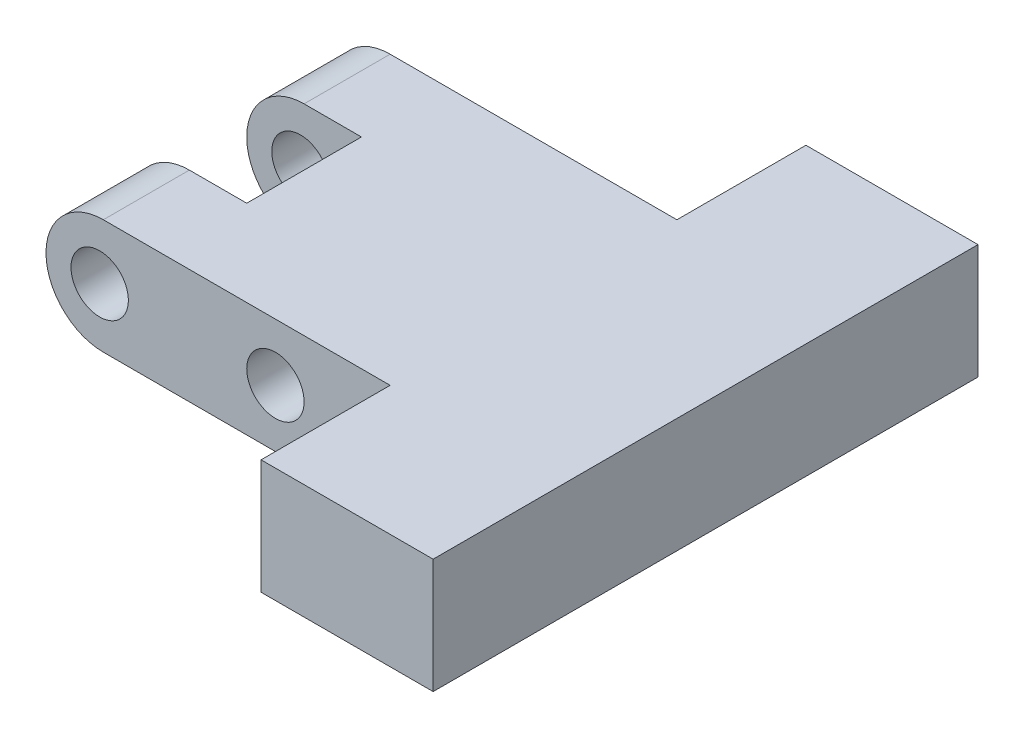
ISO-10303-21;
HEADER;
FILE_DESCRIPTION(('STEP AP214'),'2;1');
FILE_NAME('part.step','',(''),(''),'','','');
FILE_SCHEMA(('AUTOMOTIVE_DESIGN { 1 0 10303 214 1 1 1 1 }'));
ENDSEC;
DATA;
#1=APPLICATION_CONTEXT('core data for automotive mechanical design processes');
#2=APPLICATION_PROTOCOL_DEFINITION('international standard','automotive_design',2000,#1);
#3=PRODUCT_CONTEXT('',#1,'mechanical');
#4=PRODUCT('Part','Part','',(#3));
#5=PRODUCT_RELATED_PRODUCT_CATEGORY('part','',(#4));
#6=PRODUCT_DEFINITION_FORMATION('','',#4);
#7=PRODUCT_DEFINITION_CONTEXT('part definition',#1,'design');
#8=PRODUCT_DEFINITION('design','',#6,#7);
#9=PRODUCT_DEFINITION_SHAPE('','',#8);
#10=(LENGTH_UNIT() NAMED_UNIT(*) SI_UNIT(.MILLI.,.METRE.));
#11=(NAMED_UNIT(*) PLANE_ANGLE_UNIT() SI_UNIT($,.RADIAN.));
#12=(NAMED_UNIT(*) SI_UNIT($,.STERADIAN.) SOLID_ANGLE_UNIT());
#13=UNCERTAINTY_MEASURE_WITH_UNIT(LENGTH_MEASURE(1.E-05),#10,'distance_accuracy_value','');
#14=(GEOMETRIC_REPRESENTATION_CONTEXT(3) GLOBAL_UNCERTAINTY_ASSIGNED_CONTEXT((#13)) GLOBAL_UNIT_ASSIGNED_CONTEXT((#10,
#11,#12)) REPRESENTATION_CONTEXT('',''));
#15=CARTESIAN_POINT('',(0.,0.,0.));
#16=DIRECTION('',(0.,0.,1.));
#17=DIRECTION('',(1.,0.,0.));
#18=AXIS2_PLACEMENT_3D('',#15,#16,#17);
#19=CARTESIAN_POINT('',(0.,4.,0.));
#20=DIRECTION('',(0.,0.,-1.));
#21=DIRECTION('',(-1.,0.,0.));
#22=AXIS2_PLACEMENT_3D('',#19,#20,#21);
#23=PLANE('',#22);
#24=DIRECTION('',(1.,0.,0.));
#25=VECTOR('',#24,1.);
#26=CARTESIAN_POINT('',(0.,0.,0.));
#27=LINE('',#26,#25);
#28=CARTESIAN_POINT('',(0.,0.,0.));
#29=VERTEX_POINT('',#28);
#30=CARTESIAN_POINT('',(6.,0.,0.));
#31=VERTEX_POINT('',#30);
#32=EDGE_CURVE('E198',#29,#31,#27,.T.);
#33=ORIENTED_EDGE('',*,*,#32,.T.);
#34=DIRECTION('',(0.,-1.,0.));
#35=VECTOR('',#34,1.);
#36=CARTESIAN_POINT('',(6.,4.,0.));
#37=LINE('',#36,#35);
#38=CARTESIAN_POINT('',(6.,4.,0.));
#39=VERTEX_POINT('',#38);
#40=EDGE_CURVE('E11',#39,#31,#37,.T.);
#41=ORIENTED_EDGE('',*,*,#40,.F.);
#42=DIRECTION('',(1.,0.,0.));
#43=VECTOR('',#42,1.);
#44=CARTESIAN_POINT('',(0.,4.,0.));
#45=LINE('',#44,#43);
#46=CARTESIAN_POINT('',(0.,4.,0.));
#47=VERTEX_POINT('',#46);
#48=EDGE_CURVE('E202',#47,#39,#45,.T.);
#49=ORIENTED_EDGE('',*,*,#48,.F.);
#50=DIRECTION('',(0.,-1.,0.));
#51=VECTOR('',#50,1.);
#52=CARTESIAN_POINT('',(0.,4.,0.));
#53=LINE('',#52,#51);
#54=EDGE_CURVE('E246',#47,#29,#53,.T.);
#55=ORIENTED_EDGE('',*,*,#54,.T.);
#56=EDGE_LOOP('',(#33,#41,#49,#55));
#57=FACE_BOUND('',#56,.T.);
#58=ADVANCED_FACE('F41',(#57),#23,.F.);
#59=CARTESIAN_POINT('',(6.,4.,0.));
#60=DIRECTION('',(-1.,0.,0.));
#61=DIRECTION('',(0.,0.,1.));
#62=AXIS2_PLACEMENT_3D('',#59,#60,#61);
#63=PLANE('',#62);
#64=DIRECTION('',(0.,0.,-1.));
#65=VECTOR('',#64,1.);
#66=CARTESIAN_POINT('',(6.,0.,0.));
#67=LINE('',#66,#65);
#68=CARTESIAN_POINT('',(6.,0.,-19.));
#69=VERTEX_POINT('',#68);
#70=EDGE_CURVE('E230',#31,#69,#67,.T.);
#71=ORIENTED_EDGE('',*,*,#70,.T.);
#72=DIRECTION('',(0.,-1.,0.));
#73=VECTOR('',#72,1.);
#74=CARTESIAN_POINT('',(6.,4.,-19.));
#75=LINE('',#74,#73);
#76=CARTESIAN_POINT('',(6.,4.,-19.));
#77=VERTEX_POINT('',#76);
#78=EDGE_CURVE('E50',#77,#69,#75,.T.);
#79=ORIENTED_EDGE('',*,*,#78,.F.);
#80=DIRECTION('',(0.,0.,-1.));
#81=VECTOR('',#80,1.);
#82=CARTESIAN_POINT('',(6.,4.,0.));
#83=LINE('',#82,#81);
#84=EDGE_CURVE('E206',#39,#77,#83,.T.);
#85=ORIENTED_EDGE('',*,*,#84,.F.);
#86=ORIENTED_EDGE('',*,*,#40,.T.);
#87=EDGE_LOOP('',(#71,#79,#85,#86));
#88=FACE_BOUND('',#87,.T.);
#89=ADVANCED_FACE('F322',(#88),#63,.F.);
#90=CARTESIAN_POINT('',(0.,4.,-19.));
#91=DIRECTION('',(0.,0.,-1.));
#92=DIRECTION('',(-1.,0.,0.));
#93=AXIS2_PLACEMENT_3D('',#90,#91,#92);
#94=PLANE('',#93);
#95=DIRECTION('',(1.,0.,0.));
#96=VECTOR('',#95,1.);
#97=CARTESIAN_POINT('',(0.,0.,-19.));
#98=LINE('',#97,#96);
#99=CARTESIAN_POINT('',(0.,0.,-19.));
#100=VERTEX_POINT('',#99);
#101=EDGE_CURVE('E234',#100,#69,#98,.T.);
#102=ORIENTED_EDGE('',*,*,#101,.F.);
#103=DIRECTION('',(0.,-1.,0.));
#104=VECTOR('',#103,1.);
#105=CARTESIAN_POINT('',(0.,4.,-19.));
#106=LINE('',#105,#104);
#107=CARTESIAN_POINT('',(0.,4.,-19.));
#108=VERTEX_POINT('',#107);
#109=EDGE_CURVE('E255',#108,#100,#106,.T.);
#110=ORIENTED_EDGE('',*,*,#109,.F.);
#111=DIRECTION('',(1.,0.,0.));
#112=VECTOR('',#111,1.);
#113=CARTESIAN_POINT('',(0.,4.,-19.));
#114=LINE('',#113,#112);
#115=EDGE_CURVE('E210',#108,#77,#114,.T.);
#116=ORIENTED_EDGE('',*,*,#115,.T.);
#117=ORIENTED_EDGE('',*,*,#78,.T.);
#118=EDGE_LOOP('',(#102,#110,#116,#117));
#119=FACE_BOUND('',#118,.T.);
#120=ADVANCED_FACE('F327',(#119),#94,.T.);
#121=CARTESIAN_POINT('',(0.,4.,0.));
#122=DIRECTION('',(-1.,0.,0.));
#123=DIRECTION('',(0.,0.,1.));
#124=AXIS2_PLACEMENT_3D('',#121,#122,#123);
#125=PLANE('',#124);
#126=DIRECTION('',(0.,0.,-1.));
#127=VECTOR('',#126,1.);
#128=CARTESIAN_POINT('',(0.,0.,0.));
#129=LINE('',#128,#127);
#130=CARTESIAN_POINT('',(0.,0.,-14.5));
#131=VERTEX_POINT('',#130);
#132=EDGE_CURVE('E238',#131,#100,#129,.T.);
#133=ORIENTED_EDGE('',*,*,#132,.F.);
#134=DIRECTION('',(0.,-1.,0.));
#135=VECTOR('',#134,1.);
#136=CARTESIAN_POINT('',(0.,4.,-14.5));
#137=LINE('',#136,#135);
#138=CARTESIAN_POINT('',(0.,4.,-14.5));
#139=VERTEX_POINT('',#138);
#140=EDGE_CURVE('E252',#139,#131,#137,.T.);
#141=ORIENTED_EDGE('',*,*,#140,.F.);
#142=DIRECTION('',(0.,0.,-1.));
#143=VECTOR('',#142,1.);
#144=CARTESIAN_POINT('',(0.,4.,0.));
#145=LINE('',#144,#143);
#146=EDGE_CURVE('E214',#139,#108,#145,.T.);
#147=ORIENTED_EDGE('',*,*,#146,.T.);
#148=ORIENTED_EDGE('',*,*,#109,.T.);
#149=EDGE_LOOP('',(#133,#141,#147,#148));
#150=FACE_BOUND('',#149,.T.);
#151=ADVANCED_FACE('F335',(#150),#125,.T.);
#152=CARTESIAN_POINT('',(0.,4.,-14.5));
#153=DIRECTION('',(0.,0.,1.));
#154=DIRECTION('',(1.,0.,0.));
#155=AXIS2_PLACEMENT_3D('',#152,#153,#154);
#156=PLANE('',#155);
#157=CARTESIAN_POINT('',(-4.,2.,-14.5));
#158=DIRECTION('',(0.,0.,-1.));
#159=DIRECTION('',(-1.,0.,0.));
#160=AXIS2_PLACEMENT_3D('',#157,#158,#159);
#161=CIRCLE('',#160,1.);
#162=CARTESIAN_POINT('',(-5.,2.,-14.5));
#163=VERTEX_POINT('',#162);
#164=EDGE_CURVE('E276',#163,#163,#161,.T.);
#165=ORIENTED_EDGE('',*,*,#164,.F.);
#166=EDGE_LOOP('',(#165));
#167=FACE_BOUND('',#166,.T.);
#168=CARTESIAN_POINT('',(-10.1279723834454,2.,-14.5));
#169=DIRECTION('',(0.,0.,-1.));
#170=DIRECTION('',(-1.,0.,0.));
#171=AXIS2_PLACEMENT_3D('',#168,#169,#170);
#172=CIRCLE('',#171,1.);
#173=CARTESIAN_POINT('',(-11.1279723834454,2.,-14.5));
#174=VERTEX_POINT('',#173);
#175=EDGE_CURVE('E263',#174,#174,#172,.T.);
#176=ORIENTED_EDGE('',*,*,#175,.F.);
#177=EDGE_LOOP('',(#176));
#178=FACE_BOUND('',#177,.T.);
#179=DIRECTION('',(-1.,0.,0.));
#180=VECTOR('',#179,1.);
#181=CARTESIAN_POINT('',(0.,0.,-14.5));
#182=LINE('',#181,#180);
#183=CARTESIAN_POINT('',(-10.,0.,-14.5));
#184=VERTEX_POINT('',#183);
#185=EDGE_CURVE('E144',#131,#184,#182,.T.);
#186=ORIENTED_EDGE('',*,*,#185,.T.);
#187=CARTESIAN_POINT('',(-10.,2.,-14.5));
#188=DIRECTION('',(0.,0.,-1.));
#189=DIRECTION('',(1.,0.,0.));
#190=AXIS2_PLACEMENT_3D('',#187,#188,#189);
#191=CIRCLE('',#190,2.);
#192=CARTESIAN_POINT('',(-10.,4.,-14.5));
#193=VERTEX_POINT('',#192);
#194=EDGE_CURVE('E151',#184,#193,#191,.T.);
#195=ORIENTED_EDGE('',*,*,#194,.T.);
#196=DIRECTION('',(-1.,0.,0.));
#197=VECTOR('',#196,1.);
#198=CARTESIAN_POINT('',(0.,4.,-14.5));
#199=LINE('',#198,#197);
#200=EDGE_CURVE('E218',#139,#193,#199,.T.);
#201=ORIENTED_EDGE('',*,*,#200,.F.);
#202=ORIENTED_EDGE('',*,*,#140,.T.);
#203=EDGE_LOOP('',(#186,#195,#201,#202));
#204=FACE_BOUND('',#203,.T.);
#205=ADVANCED_FACE('F340',(#167,#178,#204),#156,.F.);
#206=CARTESIAN_POINT('',(-8.,4.,0.));
#207=DIRECTION('',(1.,0.,0.));
#208=DIRECTION('',(0.,0.,-1.));
#209=AXIS2_PLACEMENT_3D('',#206,#207,#208);
#210=PLANE('',#209);
#211=DIRECTION('',(0.,0.,1.));
#212=VECTOR('',#211,1.);
#213=CARTESIAN_POINT('',(-8.,4.,0.));
#214=LINE('',#213,#212);
#215=CARTESIAN_POINT('',(-8.,4.,-11.5));
#216=VERTEX_POINT('',#215);
#217=CARTESIAN_POINT('',(-8.,4.,-7.5));
#218=VERTEX_POINT('',#217);
#219=EDGE_CURVE('E58',#216,#218,#214,.T.);
#220=ORIENTED_EDGE('',*,*,#219,.F.);
#221=DIRECTION('',(0.,-1.,0.));
#222=VECTOR('',#221,1.);
#223=CARTESIAN_POINT('',(-8.,4.,-11.5));
#224=LINE('',#223,#222);
#225=CARTESIAN_POINT('',(-7.99999999999999,0.,-11.5));
#226=VERTEX_POINT('',#225);
#227=EDGE_CURVE('E146',#216,#226,#224,.T.);
#228=ORIENTED_EDGE('',*,*,#227,.T.);
#229=DIRECTION('',(0.,0.,1.));
#230=VECTOR('',#229,1.);
#231=CARTESIAN_POINT('',(-8.,0.,0.));
#232=LINE('',#231,#230);
#233=CARTESIAN_POINT('',(-8.,0.,-7.5));
#234=VERTEX_POINT('',#233);
#235=EDGE_CURVE('E133',#226,#234,#232,.T.);
#236=ORIENTED_EDGE('',*,*,#235,.T.);
#237=DIRECTION('',(0.,1.,0.));
#238=VECTOR('',#237,1.);
#239=CARTESIAN_POINT('',(-8.,0.,-7.5));
#240=LINE('',#239,#238);
#241=EDGE_CURVE('E178',#234,#218,#240,.T.);
#242=ORIENTED_EDGE('',*,*,#241,.T.);
#243=EDGE_LOOP('',(#220,#228,#236,#242));
#244=FACE_BOUND('',#243,.T.);
#245=ADVANCED_FACE('F147',(#244),#210,.F.);
#246=CARTESIAN_POINT('',(0.,4.,-4.5));
#247=DIRECTION('',(0.,0.,1.));
#248=DIRECTION('',(1.,0.,0.));
#249=AXIS2_PLACEMENT_3D('',#246,#247,#248);
#250=PLANE('',#249);
#251=CARTESIAN_POINT('',(-3.99999999999999,2.,-4.5));
#252=DIRECTION('',(0.,0.,1.));
#253=DIRECTION('',(1.,0.,0.));
#254=AXIS2_PLACEMENT_3D('',#251,#252,#253);
#255=CIRCLE('',#254,1.);
#256=CARTESIAN_POINT('',(-2.99999999999999,2.,-4.5));
#257=VERTEX_POINT('',#256);
#258=EDGE_CURVE('E44',#257,#257,#255,.T.);
#259=ORIENTED_EDGE('',*,*,#258,.F.);
#260=EDGE_LOOP('',(#259));
#261=FACE_BOUND('',#260,.T.);
#262=CARTESIAN_POINT('',(-10.1279723834454,2.,-4.5));
#263=DIRECTION('',(0.,0.,1.));
#264=DIRECTION('',(1.,0.,0.));
#265=AXIS2_PLACEMENT_3D('',#262,#263,#264);
#266=CIRCLE('',#265,1.);
#267=CARTESIAN_POINT('',(-9.12797238344536,2.,-4.5));
#268=VERTEX_POINT('',#267);
#269=EDGE_CURVE('E170',#268,#268,#266,.T.);
#270=ORIENTED_EDGE('',*,*,#269,.F.);
#271=EDGE_LOOP('',(#270));
#272=FACE_BOUND('',#271,.T.);
#273=DIRECTION('',(-1.,0.,0.));
#274=VECTOR('',#273,1.);
#275=CARTESIAN_POINT('',(0.,0.,-4.5));
#276=LINE('',#275,#274);
#277=CARTESIAN_POINT('',(0.,0.,-4.5));
#278=VERTEX_POINT('',#277);
#279=CARTESIAN_POINT('',(-10.,0.,-4.5));
#280=VERTEX_POINT('',#279);
#281=EDGE_CURVE('E143',#278,#280,#276,.T.);
#282=ORIENTED_EDGE('',*,*,#281,.F.);
#283=DIRECTION('',(0.,-1.,0.));
#284=VECTOR('',#283,1.);
#285=CARTESIAN_POINT('',(0.,4.,-4.5));
#286=LINE('',#285,#284);
#287=CARTESIAN_POINT('',(0.,4.,-4.5));
#288=VERTEX_POINT('',#287);
#289=EDGE_CURVE('E249',#288,#278,#286,.T.);
#290=ORIENTED_EDGE('',*,*,#289,.F.);
#291=DIRECTION('',(-1.,0.,0.));
#292=VECTOR('',#291,1.);
#293=CARTESIAN_POINT('',(0.,4.,-4.5));
#294=LINE('',#293,#292);
#295=CARTESIAN_POINT('',(-10.,4.,-4.5));
#296=VERTEX_POINT('',#295);
#297=EDGE_CURVE('E224',#288,#296,#294,.T.);
#298=ORIENTED_EDGE('',*,*,#297,.T.);
#299=CARTESIAN_POINT('',(-10.,2.,-4.5));
#300=DIRECTION('',(0.,0.,1.));
#301=DIRECTION('',(-1.,0.,0.));
#302=AXIS2_PLACEMENT_3D('',#299,#300,#301);
#303=CIRCLE('',#302,2.);
#304=EDGE_CURVE('E175',#296,#280,#303,.T.);
#305=ORIENTED_EDGE('',*,*,#304,.T.);
#306=EDGE_LOOP('',(#282,#290,#298,#305));
#307=FACE_BOUND('',#306,.T.);
#308=ADVANCED_FACE('F285',(#261,#272,#307),#250,.T.);
#309=EDGE_CURVE('E207',#29,#278,#129,.T.);
#310=ORIENTED_EDGE('',*,*,#309,.F.);
#311=ORIENTED_EDGE('',*,*,#54,.F.);
#312=EDGE_CURVE('E219',#47,#288,#145,.T.);
#313=ORIENTED_EDGE('',*,*,#312,.T.);
#314=ORIENTED_EDGE('',*,*,#289,.T.);
#315=EDGE_LOOP('',(#310,#311,#313,#314));
#316=FACE_BOUND('',#315,.T.);
#317=ADVANCED_FACE('F288',(#316),#125,.T.);
#318=CARTESIAN_POINT('',(0.,4.,0.));
#319=DIRECTION('',(0.,1.,0.));
#320=DIRECTION('',(0.,0.,1.));
#321=AXIS2_PLACEMENT_3D('',#318,#319,#320);
#322=PLANE('',#321);
#323=ORIENTED_EDGE('',*,*,#48,.T.);
#324=ORIENTED_EDGE('',*,*,#84,.T.);
#325=ORIENTED_EDGE('',*,*,#115,.F.);
#326=ORIENTED_EDGE('',*,*,#146,.F.);
#327=ORIENTED_EDGE('',*,*,#200,.T.);
#328=DIRECTION('',(0.,0.,-1.));
#329=VECTOR('',#328,1.);
#330=CARTESIAN_POINT('',(-9.99999999999999,4.,-11.5));
#331=LINE('',#330,#329);
#332=CARTESIAN_POINT('',(-9.99999999999999,4.,-11.5));
#333=VERTEX_POINT('',#332);
#334=EDGE_CURVE('E171',#333,#193,#331,.T.);
#335=ORIENTED_EDGE('',*,*,#334,.F.);
#336=DIRECTION('',(1.,0.,0.));
#337=VECTOR('',#336,1.);
#338=CARTESIAN_POINT('',(-8.,4.,-11.5));
#339=LINE('',#338,#337);
#340=EDGE_CURVE('E160',#333,#216,#339,.T.);
#341=ORIENTED_EDGE('',*,*,#340,.T.);
#342=ORIENTED_EDGE('',*,*,#219,.T.);
#343=DIRECTION('',(-1.,0.,0.));
#344=VECTOR('',#343,1.);
#345=CARTESIAN_POINT('',(-8.,4.,-7.5));
#346=LINE('',#345,#344);
#347=CARTESIAN_POINT('',(-10.,4.,-7.5));
#348=VERTEX_POINT('',#347);
#349=EDGE_CURVE('E181',#218,#348,#346,.T.);
#350=ORIENTED_EDGE('',*,*,#349,.T.);
#351=DIRECTION('',(0.,0.,1.));
#352=VECTOR('',#351,1.);
#353=CARTESIAN_POINT('',(-10.,4.,-7.5));
#354=LINE('',#353,#352);
#355=EDGE_CURVE('E190',#348,#296,#354,.T.);
#356=ORIENTED_EDGE('',*,*,#355,.T.);
#357=ORIENTED_EDGE('',*,*,#297,.F.);
#358=ORIENTED_EDGE('',*,*,#312,.F.);
#359=EDGE_LOOP('',(#323,#324,#325,#326,#327,#335,#341,#342,#350,#356,#357,#358));
#360=FACE_BOUND('',#359,.T.);
#361=ADVANCED_FACE('F302',(#360),#322,.T.);
#362=CARTESIAN_POINT('',(0.,0.,0.));
#363=DIRECTION('',(0.,1.,0.));
#364=DIRECTION('',(0.,0.,1.));
#365=AXIS2_PLACEMENT_3D('',#362,#363,#364);
#366=PLANE('',#365);
#367=ORIENTED_EDGE('',*,*,#32,.F.);
#368=ORIENTED_EDGE('',*,*,#309,.T.);
#369=ORIENTED_EDGE('',*,*,#281,.T.);
#370=DIRECTION('',(0.,0.,1.));
#371=VECTOR('',#370,1.);
#372=CARTESIAN_POINT('',(-10.,0.,-7.5));
#373=LINE('',#372,#371);
#374=CARTESIAN_POINT('',(-10.,0.,-7.5));
#375=VERTEX_POINT('',#374);
#376=EDGE_CURVE('E194',#375,#280,#373,.T.);
#377=ORIENTED_EDGE('',*,*,#376,.F.);
#378=DIRECTION('',(1.,0.,0.));
#379=VECTOR('',#378,1.);
#380=CARTESIAN_POINT('',(-8.,0.,-7.5));
#381=LINE('',#380,#379);
#382=EDGE_CURVE('E140',#375,#234,#381,.T.);
#383=ORIENTED_EDGE('',*,*,#382,.T.);
#384=ORIENTED_EDGE('',*,*,#235,.F.);
#385=DIRECTION('',(-1.,0.,0.));
#386=VECTOR('',#385,1.);
#387=CARTESIAN_POINT('',(-10.,0.,-11.5));
#388=LINE('',#387,#386);
#389=CARTESIAN_POINT('',(-10.,0.,-11.5));
#390=VERTEX_POINT('',#389);
#391=EDGE_CURVE('E138',#226,#390,#388,.T.);
#392=ORIENTED_EDGE('',*,*,#391,.T.);
#393=DIRECTION('',(0.,0.,-1.));
#394=VECTOR('',#393,1.);
#395=CARTESIAN_POINT('',(-10.,0.,-11.5));
#396=LINE('',#395,#394);
#397=EDGE_CURVE('E166',#390,#184,#396,.T.);
#398=ORIENTED_EDGE('',*,*,#397,.T.);
#399=ORIENTED_EDGE('',*,*,#185,.F.);
#400=ORIENTED_EDGE('',*,*,#132,.T.);
#401=ORIENTED_EDGE('',*,*,#101,.T.);
#402=ORIENTED_EDGE('',*,*,#70,.F.);
#403=EDGE_LOOP('',(#367,#368,#369,#377,#383,#384,#392,#398,#399,#400,#401,#402));
#404=FACE_BOUND('',#403,.T.);
#405=ADVANCED_FACE('F135',(#404),#366,.F.);
#406=CARTESIAN_POINT('',(-10.,2.,-7.5));
#407=DIRECTION('',(0.,0.,1.));
#408=DIRECTION('',(1.,0.,0.));
#409=AXIS2_PLACEMENT_3D('',#406,#407,#408);
#410=CYLINDRICAL_SURFACE('',#409,2.);
#411=ORIENTED_EDGE('',*,*,#304,.F.);
#412=ORIENTED_EDGE('',*,*,#355,.F.);
#413=CARTESIAN_POINT('',(-10.,2.,-7.5));
#414=DIRECTION('',(0.,0.,1.));
#415=DIRECTION('',(-1.,0.,0.));
#416=AXIS2_PLACEMENT_3D('',#413,#414,#415);
#417=CIRCLE('',#416,2.);
#418=EDGE_CURVE('E184',#348,#375,#417,.T.);
#419=ORIENTED_EDGE('',*,*,#418,.T.);
#420=ORIENTED_EDGE('',*,*,#376,.T.);
#421=EDGE_LOOP('',(#411,#412,#419,#420));
#422=FACE_BOUND('',#421,.T.);
#423=ADVANCED_FACE('F306',(#422),#410,.T.);
#424=CARTESIAN_POINT('',(-10.,2.,-7.5));
#425=DIRECTION('',(0.,0.,-1.));
#426=DIRECTION('',(-1.,0.,0.));
#427=AXIS2_PLACEMENT_3D('',#424,#425,#426);
#428=PLANE('',#427);
#429=CARTESIAN_POINT('',(-10.1279723834454,2.,-7.5));
#430=DIRECTION('',(0.,0.,-1.));
#431=DIRECTION('',(-1.,0.,0.));
#432=AXIS2_PLACEMENT_3D('',#429,#430,#431);
#433=CIRCLE('',#432,1.);
#434=CARTESIAN_POINT('',(-11.1279723834454,2.,-7.5));
#435=VERTEX_POINT('',#434);
#436=EDGE_CURVE('E262',#435,#435,#433,.T.);
#437=ORIENTED_EDGE('',*,*,#436,.F.);
#438=EDGE_LOOP('',(#437));
#439=FACE_BOUND('',#438,.T.);
#440=ORIENTED_EDGE('',*,*,#241,.F.);
#441=ORIENTED_EDGE('',*,*,#382,.F.);
#442=ORIENTED_EDGE('',*,*,#418,.F.);
#443=ORIENTED_EDGE('',*,*,#349,.F.);
#444=EDGE_LOOP('',(#440,#441,#442,#443));
#445=FACE_BOUND('',#444,.T.);
#446=ADVANCED_FACE('F308',(#439,#445),#428,.T.);
#447=CARTESIAN_POINT('',(-9.99999999999999,2.,-11.5));
#448=DIRECTION('',(0.,0.,-1.));
#449=DIRECTION('',(-1.,0.,0.));
#450=AXIS2_PLACEMENT_3D('',#447,#448,#449);
#451=CYLINDRICAL_SURFACE('',#450,2.);
#452=ORIENTED_EDGE('',*,*,#194,.F.);
#453=ORIENTED_EDGE('',*,*,#397,.F.);
#454=CARTESIAN_POINT('',(-9.99999999999999,2.,-11.5));
#455=DIRECTION('',(0.,0.,-1.));
#456=DIRECTION('',(1.,0.,0.));
#457=AXIS2_PLACEMENT_3D('',#454,#455,#456);
#458=CIRCLE('',#457,2.);
#459=EDGE_CURVE('E156',#390,#333,#458,.T.);
#460=ORIENTED_EDGE('',*,*,#459,.T.);
#461=ORIENTED_EDGE('',*,*,#334,.T.);
#462=EDGE_LOOP('',(#452,#453,#460,#461));
#463=FACE_BOUND('',#462,.T.);
#464=ADVANCED_FACE('F310',(#463),#451,.T.);
#465=CARTESIAN_POINT('',(-9.99999999999999,2.,-11.5));
#466=DIRECTION('',(0.,0.,1.));
#467=DIRECTION('',(1.,0.,0.));
#468=AXIS2_PLACEMENT_3D('',#465,#466,#467);
#469=PLANE('',#468);
#470=CARTESIAN_POINT('',(-10.1279723834454,2.,-11.5));
#471=DIRECTION('',(0.,0.,1.));
#472=DIRECTION('',(1.,0.,0.));
#473=AXIS2_PLACEMENT_3D('',#470,#471,#472);
#474=CIRCLE('',#473,1.);
#475=CARTESIAN_POINT('',(-9.12797238344536,2.,-11.5));
#476=VERTEX_POINT('',#475);
#477=EDGE_CURVE('E259',#476,#476,#474,.T.);
#478=ORIENTED_EDGE('',*,*,#477,.F.);
#479=EDGE_LOOP('',(#478));
#480=FACE_BOUND('',#479,.T.);
#481=ORIENTED_EDGE('',*,*,#227,.F.);
#482=ORIENTED_EDGE('',*,*,#340,.F.);
#483=ORIENTED_EDGE('',*,*,#459,.F.);
#484=ORIENTED_EDGE('',*,*,#391,.F.);
#485=EDGE_LOOP('',(#481,#482,#483,#484));
#486=FACE_BOUND('',#485,.T.);
#487=ADVANCED_FACE('F154',(#480,#486),#469,.T.);
#488=CARTESIAN_POINT('',(-10.1279723834454,2.,-0.499999999999988));
#489=DIRECTION('',(0.,0.,-1.));
#490=DIRECTION('',(-1.,0.,0.));
#491=AXIS2_PLACEMENT_3D('',#488,#489,#490);
#492=CYLINDRICAL_SURFACE('',#491,1.);
#493=ORIENTED_EDGE('',*,*,#477,.T.);
#494=EDGE_LOOP('',(#493));
#495=FACE_BOUND('',#494,.T.);
#496=ORIENTED_EDGE('',*,*,#175,.T.);
#497=EDGE_LOOP('',(#496));
#498=FACE_BOUND('',#497,.T.);
#499=ADVANCED_FACE('F415',(#495,#498),#492,.F.);
#500=ORIENTED_EDGE('',*,*,#269,.T.);
#501=EDGE_LOOP('',(#500));
#502=FACE_BOUND('',#501,.T.);
#503=ORIENTED_EDGE('',*,*,#436,.T.);
#504=EDGE_LOOP('',(#503));
#505=FACE_BOUND('',#504,.T.);
#506=ADVANCED_FACE('F282',(#502,#505),#492,.F.);
#507=CARTESIAN_POINT('',(-3.99999999999999,2.,-0.499999999999992));
#508=DIRECTION('',(0.,0.,-1.));
#509=DIRECTION('',(-1.,0.,0.));
#510=AXIS2_PLACEMENT_3D('',#507,#508,#509);
#511=CYLINDRICAL_SURFACE('',#510,1.);
#512=ORIENTED_EDGE('',*,*,#258,.T.);
#513=EDGE_LOOP('',(#512));
#514=FACE_BOUND('',#513,.T.);
#515=ORIENTED_EDGE('',*,*,#164,.T.);
#516=EDGE_LOOP('',(#515));
#517=FACE_BOUND('',#516,.T.);
#518=ADVANCED_FACE('F402',(#514,#517),#511,.F.);
#519=CLOSED_SHELL('',(#58,#89,#120,#151,#205,#245,#308,#317,#361,#405,#423,#446,#464,#487,#499,
#506,#518));
#520=MANIFOLD_SOLID_BREP('B2',#519);
#521=ADVANCED_BREP_SHAPE_REPRESENTATION('',(#18,#520),#14);
#522=SHAPE_DEFINITION_REPRESENTATION(#9,#521);
ENDSEC;
END-ISO-10303-21;
